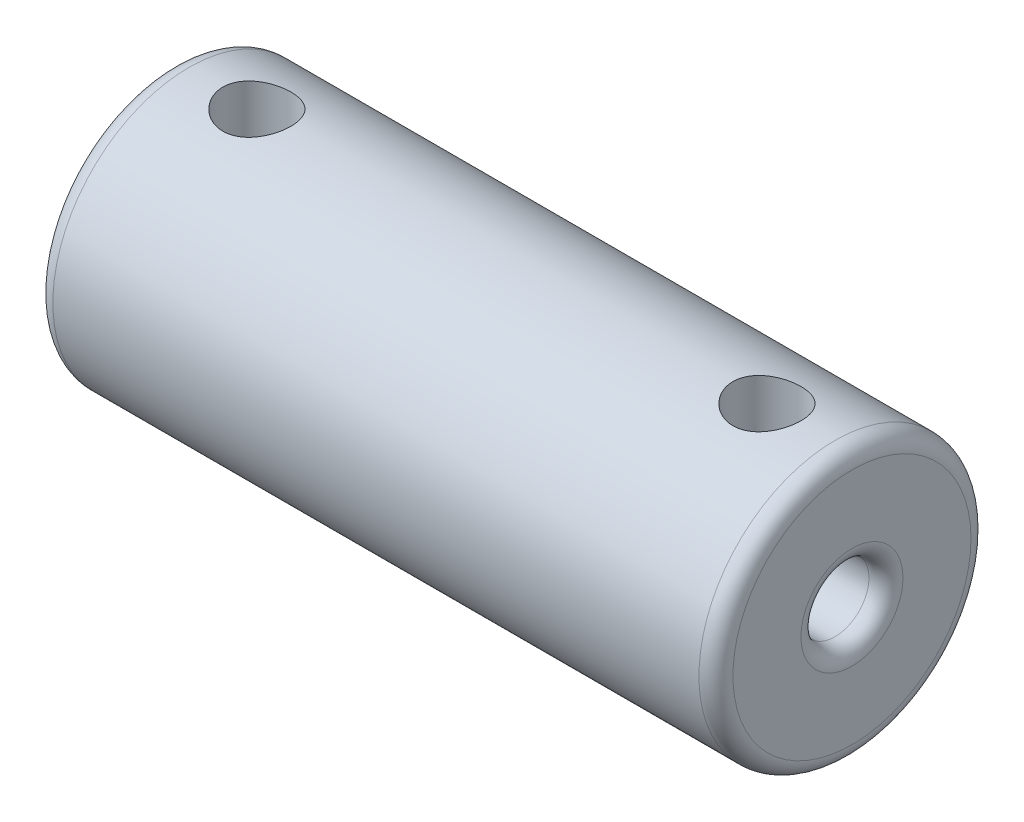
ISO-10303-21;
HEADER;
FILE_DESCRIPTION(('STEP AP214'),'2;1');
FILE_NAME('part.step','',(''),(''),'','','');
FILE_SCHEMA(('AUTOMOTIVE_DESIGN { 1 0 10303 214 1 1 1 1 }'));
ENDSEC;
DATA;
#1=APPLICATION_CONTEXT('core data for automotive mechanical design processes');
#2=APPLICATION_PROTOCOL_DEFINITION('international standard','automotive_design',2000,#1);
#3=PRODUCT_CONTEXT('',#1,'mechanical');
#4=PRODUCT('Part','Part','',(#3));
#5=PRODUCT_RELATED_PRODUCT_CATEGORY('part','',(#4));
#6=PRODUCT_DEFINITION_FORMATION('','',#4);
#7=PRODUCT_DEFINITION_CONTEXT('part definition',#1,'design');
#8=PRODUCT_DEFINITION('design','',#6,#7);
#9=PRODUCT_DEFINITION_SHAPE('','',#8);
#10=(LENGTH_UNIT() NAMED_UNIT(*) SI_UNIT(.MILLI.,.METRE.));
#11=(NAMED_UNIT(*) PLANE_ANGLE_UNIT() SI_UNIT($,.RADIAN.));
#12=(NAMED_UNIT(*) SI_UNIT($,.STERADIAN.) SOLID_ANGLE_UNIT());
#13=UNCERTAINTY_MEASURE_WITH_UNIT(LENGTH_MEASURE(1.E-05),#10,'distance_accuracy_value','');
#14=(GEOMETRIC_REPRESENTATION_CONTEXT(3) GLOBAL_UNCERTAINTY_ASSIGNED_CONTEXT((#13)) GLOBAL_UNIT_ASSIGNED_CONTEXT((#10,
#11,#12)) REPRESENTATION_CONTEXT('',''));
#15=CARTESIAN_POINT('',(0.,0.,0.));
#16=DIRECTION('',(0.,0.,1.));
#17=DIRECTION('',(1.,0.,0.));
#18=AXIS2_PLACEMENT_3D('',#15,#16,#17);
#19=CARTESIAN_POINT('',(-10.,0.,0.));
#20=DIRECTION('',(1.,0.,0.));
#21=DIRECTION('',(0.,0.,-1.));
#22=AXIS2_PLACEMENT_3D('',#19,#20,#21);
#23=CYLINDRICAL_SURFACE('',#22,4.);
#24=CARTESIAN_POINT('',(9.5,0.,0.));
#25=DIRECTION('',(1.,0.,0.));
#26=DIRECTION('',(0.,0.,-1.));
#27=AXIS2_PLACEMENT_3D('',#24,#25,#26);
#28=CIRCLE('',#27,4.);
#29=CARTESIAN_POINT('',(9.5,0.,-4.));
#30=VERTEX_POINT('',#29);
#31=EDGE_CURVE('E144',#30,#30,#28,.F.);
#32=ORIENTED_EDGE('',*,*,#31,.T.);
#33=EDGE_LOOP('',(#32));
#34=FACE_BOUND('',#33,.T.);
#35=CARTESIAN_POINT('',(-9.5,0.,0.));
#36=DIRECTION('',(1.,0.,0.));
#37=DIRECTION('',(0.,0.,-1.));
#38=AXIS2_PLACEMENT_3D('',#35,#36,#37);
#39=CIRCLE('',#38,4.);
#40=CARTESIAN_POINT('',(-9.5,0.,-4.));
#41=VERTEX_POINT('',#40);
#42=EDGE_CURVE('E143',#41,#41,#39,.T.);
#43=ORIENTED_EDGE('',*,*,#42,.T.);
#44=EDGE_LOOP('',(#43));
#45=FACE_BOUND('',#44,.T.);
#46=CARTESIAN_POINT('',(7.5,3.87298334620742,-1.));
#47=CARTESIAN_POINT('',(7.44477969964321,3.87298440057185,-0.999998431438699));
#48=CARTESIAN_POINT('',(7.38954204056864,3.87417722499278,-0.995410498208069));
#49=CARTESIAN_POINT('',(7.28065296876739,3.87880744892249,-0.977209250194446));
#50=CARTESIAN_POINT('',(7.22700249822003,3.8822461547418,-0.963590682698077));
#51=CARTESIAN_POINT('',(7.12287858471216,3.89095489813012,-0.927796479849634));
#52=CARTESIAN_POINT('',(7.07240113784224,3.8962225706936,-0.905631891140942));
#53=CARTESIAN_POINT('',(6.97587565898752,3.90799276818327,-0.853408456505405));
#54=CARTESIAN_POINT('',(6.92982781516885,3.91449534553241,-0.823349275424504));
#55=CARTESIAN_POINT('',(6.84245534189415,3.92816286540368,-0.755483370924517));
#56=CARTESIAN_POINT('',(6.80124255985972,3.93533839048709,-0.717534755081557));
#57=CARTESIAN_POINT('',(6.72569544225612,3.94945150206622,-0.635272825640327));
#58=CARTESIAN_POINT('',(6.69136174975137,3.95638906626691,-0.590958917672139));
#59=CARTESIAN_POINT('',(6.63008981294742,3.96936166208095,-0.496458080431564));
#60=CARTESIAN_POINT('',(6.60326144473539,3.975382749602,-0.446197830478043));
#61=CARTESIAN_POINT('',(6.55847614233878,3.9857232477043,-0.341705273717109));
#62=CARTESIAN_POINT('',(6.5405178992338,3.99004290933747,-0.287473554316777));
#63=CARTESIAN_POINT('',(6.51434086616856,3.99641903539262,-0.177743503501663));
#64=CARTESIAN_POINT('',(6.50593214226936,3.99851957537723,-0.12229308781959));
#65=CARTESIAN_POINT('',(6.49849664828978,4.00037437642922,-0.010731527705108));
#66=CARTESIAN_POINT('',(6.49946849111616,4.00012898438682,0.0453795178152275));
#67=CARTESIAN_POINT('',(6.51062994010006,3.99735237981413,0.155352247172387));
#68=CARTESIAN_POINT('',(6.52061453002154,3.99487200936349,0.209236215601067));
#69=CARTESIAN_POINT('',(6.5491885080194,3.98796334609942,0.314538247413686));
#70=CARTESIAN_POINT('',(6.56777835415096,3.98353494959376,0.365956179370438));
#71=CARTESIAN_POINT('',(6.61320102827482,3.97315003880358,0.465406703501806));
#72=CARTESIAN_POINT('',(6.6401068178647,3.96718007878021,0.513404509766504));
#73=CARTESIAN_POINT('',(6.7013422716465,3.9543596152386,0.604275622340488));
#74=CARTESIAN_POINT('',(6.73567322742425,3.94750895860996,0.647148035085505));
#75=CARTESIAN_POINT('',(6.81188349679295,3.93345485507808,0.727774035084956));
#76=CARTESIAN_POINT('',(6.85394195693911,3.92624687810367,0.765357679075199));
#77=CARTESIAN_POINT('',(6.9438399894161,3.91246017406683,0.832976375963018));
#78=CARTESIAN_POINT('',(6.9916798317964,3.90588147642388,0.863011076046016));
#79=CARTESIAN_POINT('',(7.09211601365958,3.89408198732659,0.914788129022597));
#80=CARTESIAN_POINT('',(7.14473429212528,3.88886793490288,0.936489566970491));
#81=CARTESIAN_POINT('',(7.25303418723058,3.88047456055983,0.97068562063634));
#82=CARTESIAN_POINT('',(7.30871514559325,3.87729480324087,0.983182206552909));
#83=CARTESIAN_POINT('',(7.41998380060925,3.87342142415656,0.99833185546607));
#84=CARTESIAN_POINT('',(7.47553511733185,3.87266435637459,1.00123618956785));
#85=CARTESIAN_POINT('',(7.58632877463126,3.87354937392416,0.997806796206218));
#86=CARTESIAN_POINT('',(7.64157114318049,3.87519123840506,0.991473919139519));
#87=CARTESIAN_POINT('',(7.74924570598188,3.88062832781824,0.969970185575064));
#88=CARTESIAN_POINT('',(7.80170909062833,3.8843878809375,0.954945627312698));
#89=CARTESIAN_POINT('',(7.90337258314067,3.89360287308385,0.916647232668248));
#90=CARTESIAN_POINT('',(7.95257230362213,3.89905851299445,0.893372419085018));
#91=CARTESIAN_POINT('',(8.04737651114694,3.91118454837305,0.838708267174623));
#92=CARTESIAN_POINT('',(8.09289153601724,3.91787667442657,0.807168701534251));
#93=CARTESIAN_POINT('',(8.17807534512054,3.93166833228686,0.737060292934455));
#94=CARTESIAN_POINT('',(8.21774316666003,3.93876793091388,0.698490294805438));
#95=CARTESIAN_POINT('',(8.29112441702838,3.95278961212643,0.614262720984725));
#96=CARTESIAN_POINT('',(8.32466402501952,3.95970280824734,0.568451952531592));
#97=CARTESIAN_POINT('',(8.3835743467805,3.97238886645494,0.471702682694675));
#98=CARTESIAN_POINT('',(8.40894548664328,3.97816178801584,0.420764448957591));
#99=CARTESIAN_POINT('',(8.45057841381117,3.98788046295326,0.31555820173109));
#100=CARTESIAN_POINT('',(8.46690571375162,3.99183932008964,0.261317381027882));
#101=CARTESIAN_POINT('',(8.49018413384336,3.99754117358315,0.150749760318808));
#102=CARTESIAN_POINT('',(8.49713706349562,3.99928459757363,0.0944233650412442));
#103=CARTESIAN_POINT('',(8.50136758957553,4.00034169408811,-0.0170835264433256));
#104=CARTESIAN_POINT('',(8.49890170909539,3.99971978880008,-0.0722538269660322));
#105=CARTESIAN_POINT('',(8.48495217270567,3.99625896457423,-0.181367496414739));
#106=CARTESIAN_POINT('',(8.47346878498689,3.99342011157094,-0.235310901780886));
#107=CARTESIAN_POINT('',(8.44194778022907,3.98585432853963,-0.340171035644815));
#108=CARTESIAN_POINT('',(8.42195654668537,3.98113764502669,-0.391102494581018));
#109=CARTESIAN_POINT('',(8.37402942098067,3.97031288913382,-0.488917053041467));
#110=CARTESIAN_POINT('',(8.34609252733043,3.96420464137727,-0.53579964126505));
#111=CARTESIAN_POINT('',(8.28228476600293,3.95107249681342,-0.625401928423899));
#112=CARTESIAN_POINT('',(8.24623985709263,3.94403016945647,-0.667994988300586));
#113=CARTESIAN_POINT('',(8.16757714802619,3.92990649053207,-0.746615020271251));
#114=CARTESIAN_POINT('',(8.12495768390205,3.92282512952424,-0.782640325068177));
#115=CARTESIAN_POINT('',(8.0333985857987,3.90927475860683,-0.847762026479239));
#116=CARTESIAN_POINT('',(7.98435587658752,3.90281963730391,-0.876716619446592));
#117=CARTESIAN_POINT('',(7.88194451007715,3.8914395555011,-0.925926896615621));
#118=CARTESIAN_POINT('',(7.82857903389271,3.88651348244814,-0.946188909759556));
#119=CARTESIAN_POINT('',(7.72942298817372,3.87951908741315,-0.974422528565571));
#120=CARTESIAN_POINT('',(7.68410683561764,3.87708663005761,-0.983993170595828));
#121=CARTESIAN_POINT('',(7.59253113099853,3.87381838580358,-0.996782292572819));
#122=CARTESIAN_POINT('',(7.54627165974937,3.87298246270639,-1.00000131437052));
#123=CARTESIAN_POINT('',(7.5,3.87298334620742,-1.));
#124=B_SPLINE_CURVE_WITH_KNOTS('',3,(#46,#47,#48,#49,#50,#51,#52,#53,#54,#55,#56,#57,#58,#59,
#60,#61,#62,#63,#64,#65,#66,#67,#68,#69,#70,#71,#72,#73,#74,#75,#76,#77,#78,#79,#80,#81,#82,#83,
#84,#85,#86,#87,#88,#89,#90,#91,#92,#93,#94,#95,#96,#97,#98,#99,#100,#101,#102,#103,#104,#105,
#106,#107,#108,#109,#110,#111,#112,#113,#114,#115,#116,#117,#118,#119,#120,#121,#122,#123),
.UNSPECIFIED.,.T.,.F.,(4,2,2,2,2,2,2,2,2,2,2,2,2,2,2,2,2,2,2,2,2,2,2,2,2,2,2,2,2,2,2,2,2,2,2,2,
2,2,4),(0.,0.16549097667523,0.331078296534211,0.496452290829154,0.661833306984659,
0.830495816734649,0.999174085882211,1.17020598555442,1.34121263935111,1.50875500394413,
1.67627259462683,1.84007305071853,2.00388222686189,2.16917149698052,2.3344895418384,
2.50428186625039,2.67408212476195,2.84470572799635,3.01529280048093,3.18137429900961,
3.34744050869795,3.51078961999957,3.67415808564841,3.84073138339937,4.00733207550292,
4.17810132382402,4.34886166284095,4.51836829119046,4.68784219559889,4.85273378447257,
5.01762046947067,5.18161950620158,5.34563922291503,5.51358838629102,5.68158012622478,
5.85270590910145,6.02370688542922,6.16239130867206,6.30106390036083),.UNSPECIFIED.);
#125=CARTESIAN_POINT('',(7.5,3.87298334620742,-1.));
#126=VERTEX_POINT('',#125);
#127=EDGE_CURVE('E57',#126,#126,#124,.T.);
#128=ORIENTED_EDGE('',*,*,#127,.F.);
#129=EDGE_LOOP('',(#128));
#130=FACE_BOUND('',#129,.T.);
#131=CARTESIAN_POINT('',(-7.5,3.87298334620742,-1.));
#132=CARTESIAN_POINT('',(-7.55522030035679,3.87298440057185,-0.999998431438699));
#133=CARTESIAN_POINT('',(-7.61045795943136,3.87417722499278,-0.995410498208069));
#134=CARTESIAN_POINT('',(-7.71934703123261,3.87880744892249,-0.977209250194446));
#135=CARTESIAN_POINT('',(-7.77299750177997,3.8822461547418,-0.963590682698077));
#136=CARTESIAN_POINT('',(-7.87712141528784,3.89095489813012,-0.927796479849635));
#137=CARTESIAN_POINT('',(-7.92759886215776,3.8962225706936,-0.905631891140944));
#138=CARTESIAN_POINT('',(-8.02412434101248,3.90799276818327,-0.853408456505407));
#139=CARTESIAN_POINT('',(-8.07017218483115,3.91449534553241,-0.823349275424505));
#140=CARTESIAN_POINT('',(-8.15754465810585,3.92816286540368,-0.755483370924518));
#141=CARTESIAN_POINT('',(-8.19875744014028,3.93533839048709,-0.717534755081558));
#142=CARTESIAN_POINT('',(-8.27430455774388,3.94945150206622,-0.635272825640329));
#143=CARTESIAN_POINT('',(-8.30863825024863,3.95638906626691,-0.590958917672141));
#144=CARTESIAN_POINT('',(-8.36991018705258,3.96936166208095,-0.496458080431566));
#145=CARTESIAN_POINT('',(-8.39673855526461,3.975382749602,-0.446197830478045));
#146=CARTESIAN_POINT('',(-8.44152385766121,3.9857232477043,-0.341705273717111));
#147=CARTESIAN_POINT('',(-8.4594821007662,3.99004290933747,-0.287473554316779));
#148=CARTESIAN_POINT('',(-8.48565913383144,3.99641903539262,-0.177743503501665));
#149=CARTESIAN_POINT('',(-8.49406785773064,3.99851957537723,-0.122293087819592));
#150=CARTESIAN_POINT('',(-8.50150335171022,4.00037437642922,-0.0107315277051099));
#151=CARTESIAN_POINT('',(-8.50053150888384,4.00012898438682,0.0453795178152256));
#152=CARTESIAN_POINT('',(-8.48937005989994,3.99735237981413,0.155352247172386));
#153=CARTESIAN_POINT('',(-8.47938546997846,3.99487200936349,0.209236215601066));
#154=CARTESIAN_POINT('',(-8.4508114919806,3.98796334609942,0.314538247413685));
#155=CARTESIAN_POINT('',(-8.43222164584904,3.98353494959376,0.365956179370436));
#156=CARTESIAN_POINT('',(-8.38679897172518,3.97315003880358,0.465406703501805));
#157=CARTESIAN_POINT('',(-8.3598931821353,3.96718007878021,0.513404509766503));
#158=CARTESIAN_POINT('',(-8.2986577283535,3.9543596152386,0.604275622340488));
#159=CARTESIAN_POINT('',(-8.26432677257575,3.94750895860996,0.647148035085504));
#160=CARTESIAN_POINT('',(-8.18811650320705,3.93345485507808,0.727774035084955));
#161=CARTESIAN_POINT('',(-8.14605804306089,3.92624687810367,0.765357679075198));
#162=CARTESIAN_POINT('',(-8.0561600105839,3.91246017406683,0.832976375963017));
#163=CARTESIAN_POINT('',(-8.0083201682036,3.90588147642388,0.863011076046015));
#164=CARTESIAN_POINT('',(-7.90788398634042,3.89408198732659,0.914788129022597));
#165=CARTESIAN_POINT('',(-7.85526570787472,3.88886793490288,0.93648956697049));
#166=CARTESIAN_POINT('',(-7.74696581276942,3.88047456055983,0.97068562063634));
#167=CARTESIAN_POINT('',(-7.69128485440675,3.87729480324087,0.983182206552909));
#168=CARTESIAN_POINT('',(-7.58001619939076,3.87342142415656,0.99833185546607));
#169=CARTESIAN_POINT('',(-7.52446488266815,3.87266435637459,1.00123618956785));
#170=CARTESIAN_POINT('',(-7.41367122536874,3.87354937392416,0.997806796206219));
#171=CARTESIAN_POINT('',(-7.35842885681951,3.87519123840506,0.99147391913952));
#172=CARTESIAN_POINT('',(-7.25075429401812,3.88062832781824,0.969970185575065));
#173=CARTESIAN_POINT('',(-7.19829090937167,3.8843878809375,0.954945627312698));
#174=CARTESIAN_POINT('',(-7.09662741685933,3.89360287308385,0.916647232668248));
#175=CARTESIAN_POINT('',(-7.04742769637787,3.89905851299445,0.893372419085018));
#176=CARTESIAN_POINT('',(-6.95262348885306,3.91118454837305,0.838708267174623));
#177=CARTESIAN_POINT('',(-6.90710846398276,3.91787667442657,0.807168701534252));
#178=CARTESIAN_POINT('',(-6.82192465487946,3.93166833228686,0.737060292934457));
#179=CARTESIAN_POINT('',(-6.78225683333997,3.93876793091388,0.69849029480544));
#180=CARTESIAN_POINT('',(-6.70887558297162,3.95278961212643,0.614262720984727));
#181=CARTESIAN_POINT('',(-6.67533597498048,3.95970280824734,0.568451952531594));
#182=CARTESIAN_POINT('',(-6.6164256532195,3.97238886645493,0.471702682694677));
#183=CARTESIAN_POINT('',(-6.59105451335672,3.97816178801584,0.420764448957593));
#184=CARTESIAN_POINT('',(-6.54942158618883,3.98788046295326,0.315558201731092));
#185=CARTESIAN_POINT('',(-6.53309428624838,3.99183932008964,0.261317381027883));
#186=CARTESIAN_POINT('',(-6.50981586615663,3.99754117358315,0.150749760318809));
#187=CARTESIAN_POINT('',(-6.50286293650438,3.99928459757363,0.0944233650412453));
#188=CARTESIAN_POINT('',(-6.49863241042447,4.00034169408811,-0.0170835264433247));
#189=CARTESIAN_POINT('',(-6.50109829090461,3.99971978880008,-0.0722538269660316));
#190=CARTESIAN_POINT('',(-6.51504782729433,3.99625896457423,-0.181367496414738));
#191=CARTESIAN_POINT('',(-6.5265312150131,3.99342011157095,-0.235310901780885));
#192=CARTESIAN_POINT('',(-6.55805221977093,3.98585432853963,-0.340171035644814));
#193=CARTESIAN_POINT('',(-6.57804345331463,3.98113764502669,-0.391102494581017));
#194=CARTESIAN_POINT('',(-6.62597057901933,3.97031288913382,-0.488917053041466));
#195=CARTESIAN_POINT('',(-6.65390747266957,3.96420464137727,-0.535799641265049));
#196=CARTESIAN_POINT('',(-6.71771523399707,3.95107249681342,-0.625401928423899));
#197=CARTESIAN_POINT('',(-6.75376014290737,3.94403016945646,-0.667994988300586));
#198=CARTESIAN_POINT('',(-6.83242285197381,3.92990649053207,-0.746615020271251));
#199=CARTESIAN_POINT('',(-6.87504231609794,3.92282512952424,-0.782640325068176));
#200=CARTESIAN_POINT('',(-6.96660141420129,3.90927475860683,-0.847762026479239));
#201=CARTESIAN_POINT('',(-7.01564412341248,3.90281963730391,-0.876716619446592));
#202=CARTESIAN_POINT('',(-7.11805548992285,3.8914395555011,-0.925926896615621));
#203=CARTESIAN_POINT('',(-7.17142096610729,3.88651348244814,-0.946188909759556));
#204=CARTESIAN_POINT('',(-7.27057701182627,3.87951908741315,-0.97442252856557));
#205=CARTESIAN_POINT('',(-7.31589316438236,3.87708663005761,-0.983993170595828));
#206=CARTESIAN_POINT('',(-7.40746886900147,3.87381838580358,-0.996782292572819));
#207=CARTESIAN_POINT('',(-7.45372834025063,3.87298246270639,-1.00000131437052));
#208=CARTESIAN_POINT('',(-7.5,3.87298334620742,-1.));
#209=B_SPLINE_CURVE_WITH_KNOTS('',3,(#131,#132,#133,#134,#135,#136,#137,#138,#139,#140,#141,
#142,#143,#144,#145,#146,#147,#148,#149,#150,#151,#152,#153,#154,#155,#156,#157,#158,#159,#160,
#161,#162,#163,#164,#165,#166,#167,#168,#169,#170,#171,#172,#173,#174,#175,#176,#177,#178,#179,
#180,#181,#182,#183,#184,#185,#186,#187,#188,#189,#190,#191,#192,#193,#194,#195,#196,#197,#198,
#199,#200,#201,#202,#203,#204,#205,#206,#207,#208),.UNSPECIFIED.,.T.,.F.,(4,2,2,2,2,2,2,2,2,2,2,
2,2,2,2,2,2,2,2,2,2,2,2,2,2,2,2,2,2,2,2,2,2,2,2,2,2,2,4),(0.,0.16549097667523,0.33107829653421,
0.496452290829151,0.661833306984657,0.830495816734647,0.999174085882209,1.17020598555442,
1.34121263935111,1.50875500394413,1.67627259462682,1.84007305071853,2.00388222686189,
2.16917149698052,2.3344895418384,2.50428186625039,2.67408212476195,2.84470572799635,
3.01529280048093,3.18137429900961,3.34744050869795,3.51078961999957,3.67415808564841,
3.84073138339937,4.00733207550292,4.17810132382402,4.34886166284096,4.51836829119046,
4.6878421955989,4.85273378447257,5.01762046947067,5.18161950620159,5.34563922291503,
5.51358838629103,5.68158012622478,5.85270590910145,6.02370688542922,6.16239130867206,
6.30106390036083),.UNSPECIFIED.);
#210=CARTESIAN_POINT('',(-7.5,3.87298334620742,-1.));
#211=VERTEX_POINT('',#210);
#212=EDGE_CURVE('E88',#211,#211,#209,.T.);
#213=ORIENTED_EDGE('',*,*,#212,.F.);
#214=EDGE_LOOP('',(#213));
#215=FACE_BOUND('',#214,.T.);
#216=ADVANCED_FACE('F36',(#34,#45,#130,#215),#23,.T.);
#217=CARTESIAN_POINT('',(0.,0.,0.));
#218=DIRECTION('',(1.,0.,0.));
#219=DIRECTION('',(0.,0.,-1.));
#220=AXIS2_PLACEMENT_3D('',#217,#218,#219);
#221=CYLINDRICAL_SURFACE('',#220,1.);
#222=CARTESIAN_POINT('',(9.5,0.,0.));
#223=DIRECTION('',(1.,0.,0.));
#224=DIRECTION('',(0.,0.,-1.));
#225=AXIS2_PLACEMENT_3D('',#222,#223,#224);
#226=CIRCLE('',#225,1.);
#227=CARTESIAN_POINT('',(9.5,0.,-1.));
#228=VERTEX_POINT('',#227);
#229=EDGE_CURVE('E161',#228,#228,#226,.T.);
#230=ORIENTED_EDGE('',*,*,#229,.T.);
#231=EDGE_LOOP('',(#230));
#232=FACE_BOUND('',#231,.T.);
#233=CARTESIAN_POINT('',(0.,0.,0.));
#234=DIRECTION('',(1.,0.,0.));
#235=DIRECTION('',(0.,0.,-1.));
#236=AXIS2_PLACEMENT_3D('',#233,#234,#235);
#237=CIRCLE('',#236,1.);
#238=CARTESIAN_POINT('',(0.,0.,-1.));
#239=VERTEX_POINT('',#238);
#240=EDGE_CURVE('E95',#239,#239,#237,.T.);
#241=ORIENTED_EDGE('',*,*,#240,.F.);
#242=EDGE_LOOP('',(#241));
#243=FACE_BOUND('',#242,.T.);
#244=CARTESIAN_POINT('',(7.5,0.,0.));
#245=DIRECTION('',(0.707106781186547,-0.707106781186547,0.));
#246=DIRECTION('',(-0.707106781186547,-0.707106781186547,0.));
#247=AXIS2_PLACEMENT_3D('',#244,#245,#246);
#248=ELLIPSE('',#247,1.41421356237309,1.);
#249=CARTESIAN_POINT('',(7.5,0.,1.));
#250=VERTEX_POINT('',#249);
#251=CARTESIAN_POINT('',(7.5,0.,-1.));
#252=VERTEX_POINT('',#251);
#253=EDGE_CURVE('E50',#250,#252,#248,.F.);
#254=ORIENTED_EDGE('',*,*,#253,.T.);
#255=CARTESIAN_POINT('',(7.5,0.,0.));
#256=DIRECTION('',(-0.707106781186547,-0.707106781186547,0.));
#257=DIRECTION('',(0.707106781186547,-0.707106781186547,0.));
#258=AXIS2_PLACEMENT_3D('',#255,#256,#257);
#259=ELLIPSE('',#258,1.41421356237309,1.);
#260=EDGE_CURVE('E52',#252,#250,#259,.F.);
#261=ORIENTED_EDGE('',*,*,#260,.T.);
#262=EDGE_LOOP('',(#254,#261));
#263=FACE_BOUND('',#262,.T.);
#264=ADVANCED_FACE('F56',(#232,#243,#263),#221,.F.);
#265=CARTESIAN_POINT('',(0.,0.,0.));
#266=DIRECTION('',(-1.,0.,0.));
#267=DIRECTION('',(0.,0.,1.));
#268=AXIS2_PLACEMENT_3D('',#265,#266,#267);
#269=CYLINDRICAL_SURFACE('',#268,2.);
#270=CARTESIAN_POINT('',(-9.5,0.,0.));
#271=DIRECTION('',(1.,0.,0.));
#272=DIRECTION('',(0.,0.,-1.));
#273=AXIS2_PLACEMENT_3D('',#270,#271,#272);
#274=CIRCLE('',#273,2.);
#275=CARTESIAN_POINT('',(-9.5,0.,-2.));
#276=VERTEX_POINT('',#275);
#277=EDGE_CURVE('E11',#276,#276,#274,.F.);
#278=ORIENTED_EDGE('',*,*,#277,.T.);
#279=EDGE_LOOP('',(#278));
#280=FACE_BOUND('',#279,.T.);
#281=CARTESIAN_POINT('',(0.,0.,0.));
#282=DIRECTION('',(-1.,0.,0.));
#283=DIRECTION('',(0.,0.,1.));
#284=AXIS2_PLACEMENT_3D('',#281,#282,#283);
#285=CIRCLE('',#284,2.);
#286=CARTESIAN_POINT('',(0.,0.,2.));
#287=VERTEX_POINT('',#286);
#288=EDGE_CURVE('E69',#287,#287,#285,.T.);
#289=ORIENTED_EDGE('',*,*,#288,.F.);
#290=EDGE_LOOP('',(#289));
#291=FACE_BOUND('',#290,.T.);
#292=CARTESIAN_POINT('',(-7.5,1.73205080756888,-1.));
#293=CARTESIAN_POINT('',(-7.55210780819525,1.73205534728459,-0.999996363074531));
#294=CARTESIAN_POINT('',(-7.60428141152505,1.73443801187756,-0.995899970733216));
#295=CARTESIAN_POINT('',(-7.70702726467715,1.74362366452052,-0.979723209898053));
#296=CARTESIAN_POINT('',(-7.75759591504341,1.75043594055559,-0.967626064554179));
#297=CARTESIAN_POINT('',(-7.85545166434394,1.76749346605398,-0.936099948699812));
#298=CARTESIAN_POINT('',(-7.90275465247359,1.77772043473252,-0.91670995249373));
#299=CARTESIAN_POINT('',(-7.99342420199672,1.80042664816858,-0.871267525376372));
#300=CARTESIAN_POINT('',(-8.03679055026246,1.81290601476065,-0.845214734035773));
#301=CARTESIAN_POINT('',(-8.12230572855751,1.83996869057441,-0.784666540530879));
#302=CARTESIAN_POINT('',(-8.16405913567355,1.85464063637954,-0.74965203614377));
#303=CARTESIAN_POINT('',(-8.24140838840671,1.88371982785706,-0.673253807614468));
#304=CARTESIAN_POINT('',(-8.27700116258352,1.8981269383125,-0.631866925782293));
#305=CARTESIAN_POINT('',(-8.34336715114766,1.92621476952949,-0.540489563414547));
#306=CARTESIAN_POINT('',(-8.37365376785953,1.93978106418172,-0.490107189012576));
#307=CARTESIAN_POINT('',(-8.42514085324576,1.96350756099529,-0.384157026599504));
#308=CARTESIAN_POINT('',(-8.44634705613717,1.97366991183742,-0.328592538138155));
#309=CARTESIAN_POINT('',(-8.4775046613011,1.98880461244237,-0.218044943925977));
#310=CARTESIAN_POINT('',(-8.48814952635553,1.99409480220892,-0.163301790488818));
#311=CARTESIAN_POINT('',(-8.50016611867504,2.00007583846067,-0.0525706286978484));
#312=CARTESIAN_POINT('',(-8.50154345679571,2.0007694678459,0.00341660584373814));
#313=CARTESIAN_POINT('',(-8.49525332602965,1.9976298191645,0.109832524423749));
#314=CARTESIAN_POINT('',(-8.48836198447878,1.9941849589216,0.160321199176791));
#315=CARTESIAN_POINT('',(-8.46711915609534,1.98374245259747,0.259313771918322));
#316=CARTESIAN_POINT('',(-8.45276711102378,1.97674454066394,0.307817521093925));
#317=CARTESIAN_POINT('',(-8.41691743391019,1.95971583287654,0.402309391569553));
#318=CARTESIAN_POINT('',(-8.39532368682793,1.94964441529199,0.448253423515178));
#319=CARTESIAN_POINT('',(-8.34573658379851,1.92737645986687,0.535976801513328));
#320=CARTESIAN_POINT('',(-8.31774093669765,1.91517916157484,0.577754648838646));
#321=CARTESIAN_POINT('',(-8.25310464846699,1.88844394399229,0.660173660898195));
#322=CARTESIAN_POINT('',(-8.21589697167399,1.87379375998175,0.70033407502936));
#323=CARTESIAN_POINT('',(-8.13541027506982,1.84454340586812,0.77410437029778));
#324=CARTESIAN_POINT('',(-8.09212662772594,1.82994328265629,0.807709211574231));
#325=CARTESIAN_POINT('',(-7.99735180757591,1.80144156092485,0.869505334642211));
#326=CARTESIAN_POINT('',(-7.94551397694579,1.78764319990708,0.897217314978051));
#327=CARTESIAN_POINT('',(-7.837062328641,1.76375450278576,0.943319113001231));
#328=CARTESIAN_POINT('',(-7.78045356698244,1.75366030046067,0.961718658210889));
#329=CARTESIAN_POINT('',(-7.66878548871721,1.73944635817034,0.98718021102504));
#330=CARTESIAN_POINT('',(-7.61395888095645,1.73491655848496,0.995025122119975));
#331=CARTESIAN_POINT('',(-7.50359865848346,1.7311791936161,1.00151694661143));
#332=CARTESIAN_POINT('',(-7.44806557088021,1.73196786889312,1.00017035731503));
#333=CARTESIAN_POINT('',(-7.34434608142127,1.73834336540585,0.989036043343966));
#334=CARTESIAN_POINT('',(-7.29602054889207,1.74339587506654,0.980187816712467));
#335=CARTESIAN_POINT('',(-7.20163221372904,1.75694021551341,0.955696284632441));
#336=CARTESIAN_POINT('',(-7.15557014925339,1.76543316005034,0.940050778623614));
#337=CARTESIAN_POINT('',(-7.06458866909731,1.78536222079657,0.901647588604886));
#338=CARTESIAN_POINT('',(-7.01982098314645,1.79691643243063,0.878594063692723));
#339=CARTESIAN_POINT('',(-6.93453072846101,1.8215611949725,0.826287064015804));
#340=CARTESIAN_POINT('',(-6.89401035648672,1.83465253355148,0.797030404332216));
#341=CARTESIAN_POINT('',(-6.81302123247645,1.86287998456336,0.728837167198853));
#342=CARTESIAN_POINT('',(-6.77320284928234,1.87806583154289,0.689145272314966));
#343=CARTESIAN_POINT('',(-6.70058776200641,1.90734234977892,0.603404495398289));
#344=CARTESIAN_POINT('',(-6.66779342976946,1.92143265007709,0.557353474655347));
#345=CARTESIAN_POINT('',(-6.6094262740499,1.94741361690957,0.458535362558757));
#346=CARTESIAN_POINT('',(-6.58406688178909,1.95923641672029,0.405623097574113));
#347=CARTESIAN_POINT('',(-6.54286209614261,1.97883354959301,0.295522364641082));
#348=CARTESIAN_POINT('',(-6.5270083486337,1.98661143676373,0.238337701392176));
#349=CARTESIAN_POINT('',(-6.50663143582534,1.99667508181883,0.126979682330417));
#350=CARTESIAN_POINT('',(-6.50120212412389,1.99939927908191,0.0730114438504571));
#351=CARTESIAN_POINT('',(-6.4991567345456,2.00042130375131,-0.0351259859512033));
#352=CARTESIAN_POINT('',(-6.50253757147644,1.9987206806689,-0.0892951002950865));
#353=CARTESIAN_POINT('',(-6.51741640679563,1.99133968837923,-0.192537992317147));
#354=CARTESIAN_POINT('',(-6.52836484925767,1.9859289466799,-0.241712317811264));
#355=CARTESIAN_POINT('',(-6.55732699930297,1.97192093663423,-0.337445952183617));
#356=CARTESIAN_POINT('',(-6.57534172009345,1.96332321132796,-0.384004884955508));
#357=CARTESIAN_POINT('',(-6.61872705216598,1.9432593074812,-0.475423406244884));
#358=CARTESIAN_POINT('',(-6.64437932320784,1.93168617198799,-0.520125142700046));
#359=CARTESIAN_POINT('',(-6.70195793085905,1.90688133141826,-0.604774641814024));
#360=CARTESIAN_POINT('',(-6.73388714911567,1.89364886558361,-0.644720207414907));
#361=CARTESIAN_POINT('',(-6.8067971390227,1.86528610226628,-0.722914004156891));
#362=CARTESIAN_POINT('',(-6.84836248747719,1.85009799011698,-0.760597684539271));
#363=CARTESIAN_POINT('',(-6.93745072112977,1.82063076162852,-0.828663287394675));
#364=CARTESIAN_POINT('',(-6.98497882086769,1.80635245761865,-0.859038750010058));
#365=CARTESIAN_POINT('',(-7.08663664658096,1.77999605304916,-0.912431079785654));
#366=CARTESIAN_POINT('',(-7.14092753112874,1.7680017425627,-0.935185065960939));
#367=CARTESIAN_POINT('',(-7.25333240433978,1.74866156328352,-0.970878709506412));
#368=CARTESIAN_POINT('',(-7.31143288891269,1.74130016147702,-0.983851191175346));
#369=CARTESIAN_POINT('',(-7.391805355652,1.73529272601791,-0.994367007864414));
#370=CARTESIAN_POINT('',(-7.41336789439789,1.73408129005152,-0.996476104963851));
#371=CARTESIAN_POINT('',(-7.45661648068224,1.7324593588775,-0.999293405089963));
#372=CARTESIAN_POINT('',(-7.47830253638588,1.73204891725109,-1.00000151439987));
#373=CARTESIAN_POINT('',(-7.5,1.73205080756888,-1.));
#374=B_SPLINE_CURVE_WITH_KNOTS('',3,(#292,#293,#294,#295,#296,#297,#298,#299,#300,#301,#302,
#303,#304,#305,#306,#307,#308,#309,#310,#311,#312,#313,#314,#315,#316,#317,#318,#319,#320,#321,
#322,#323,#324,#325,#326,#327,#328,#329,#330,#331,#332,#333,#334,#335,#336,#337,#338,#339,#340,
#341,#342,#343,#344,#345,#346,#347,#348,#349,#350,#351,#352,#353,#354,#355,#356,#357,#358,#359,
#360,#361,#362,#363,#364,#365,#366,#367,#368,#369,#370,#371,#372,#373),.UNSPECIFIED.,.T.,.F.,(4,
2,2,2,2,2,2,2,2,2,2,2,2,2,2,2,2,2,2,2,2,2,2,2,2,2,2,2,2,2,2,2,2,2,2,2,2,2,2,2,4),(0.,
0.156232122594716,0.312792892824805,0.468528595918885,0.62427272544515,0.792862312498234,
0.961535710843708,1.14157892238763,1.32150826963891,1.48863484967935,1.6556602368604,
1.80816097484538,1.96067312517455,2.11529534731147,2.26997299350272,2.43927191456891,
2.60870048245919,2.78888841729448,2.96888774211705,3.13462290854212,3.30024093188373,
3.44774183424025,3.59529052436063,3.74967296406088,3.90413486220047,4.07806743580613,
4.25205864978202,4.43064181412966,4.60906779808771,4.77112270389487,4.93312086793971,
5.08444424871492,5.23578933512013,5.39360750719472,5.55149830100719,5.72510241850067,
5.89885942845154,6.07810749038605,6.2567513300276,6.32180135185309,6.3868557249454),.UNSPECIFIED.);
#375=CARTESIAN_POINT('',(-7.5,1.73205080756888,-1.));
#376=VERTEX_POINT('',#375);
#377=EDGE_CURVE('E60',#376,#376,#374,.T.);
#378=ORIENTED_EDGE('',*,*,#377,.T.);
#379=EDGE_LOOP('',(#378));
#380=FACE_BOUND('',#379,.T.);
#381=ADVANCED_FACE('F99',(#280,#291,#380),#269,.F.);
#382=CARTESIAN_POINT('',(-10.,0.,0.));
#383=DIRECTION('',(1.,0.,0.));
#384=DIRECTION('',(0.,0.,-1.));
#385=AXIS2_PLACEMENT_3D('',#382,#383,#384);
#386=PLANE('',#385);
#387=CARTESIAN_POINT('',(-10.,0.,0.));
#388=DIRECTION('',(1.,0.,0.));
#389=DIRECTION('',(0.,0.,-1.));
#390=AXIS2_PLACEMENT_3D('',#387,#388,#389);
#391=CIRCLE('',#390,3.5);
#392=CARTESIAN_POINT('',(-10.,0.,-3.5));
#393=VERTEX_POINT('',#392);
#394=EDGE_CURVE('E44',#393,#393,#391,.F.);
#395=ORIENTED_EDGE('',*,*,#394,.T.);
#396=EDGE_LOOP('',(#395));
#397=FACE_BOUND('',#396,.T.);
#398=CARTESIAN_POINT('',(-10.,0.,0.));
#399=DIRECTION('',(1.,0.,0.));
#400=DIRECTION('',(0.,0.,-1.));
#401=AXIS2_PLACEMENT_3D('',#398,#399,#400);
#402=CIRCLE('',#401,2.5);
#403=CARTESIAN_POINT('',(-10.,0.,-2.5));
#404=VERTEX_POINT('',#403);
#405=EDGE_CURVE('E147',#404,#404,#402,.T.);
#406=ORIENTED_EDGE('',*,*,#405,.T.);
#407=EDGE_LOOP('',(#406));
#408=FACE_BOUND('',#407,.T.);
#409=ADVANCED_FACE('F102',(#397,#408),#386,.F.);
#410=CARTESIAN_POINT('',(10.,0.,0.));
#411=DIRECTION('',(1.,0.,0.));
#412=DIRECTION('',(0.,0.,-1.));
#413=AXIS2_PLACEMENT_3D('',#410,#411,#412);
#414=PLANE('',#413);
#415=CARTESIAN_POINT('',(10.,0.,0.));
#416=DIRECTION('',(1.,0.,0.));
#417=DIRECTION('',(0.,0.,-1.));
#418=AXIS2_PLACEMENT_3D('',#415,#416,#417);
#419=CIRCLE('',#418,1.5);
#420=CARTESIAN_POINT('',(10.,0.,-1.5));
#421=VERTEX_POINT('',#420);
#422=EDGE_CURVE('E145',#421,#421,#419,.F.);
#423=ORIENTED_EDGE('',*,*,#422,.T.);
#424=EDGE_LOOP('',(#423));
#425=FACE_BOUND('',#424,.T.);
#426=CARTESIAN_POINT('',(10.,0.,0.));
#427=DIRECTION('',(1.,0.,0.));
#428=DIRECTION('',(0.,0.,-1.));
#429=AXIS2_PLACEMENT_3D('',#426,#427,#428);
#430=CIRCLE('',#429,3.5);
#431=CARTESIAN_POINT('',(10.,0.,-3.5));
#432=VERTEX_POINT('',#431);
#433=EDGE_CURVE('E150',#432,#432,#430,.T.);
#434=ORIENTED_EDGE('',*,*,#433,.T.);
#435=EDGE_LOOP('',(#434));
#436=FACE_BOUND('',#435,.T.);
#437=ADVANCED_FACE('F109',(#425,#436),#414,.T.);
#438=CARTESIAN_POINT('',(0.,0.,0.));
#439=DIRECTION('',(-1.,0.,0.));
#440=DIRECTION('',(0.,0.,1.));
#441=AXIS2_PLACEMENT_3D('',#438,#439,#440);
#442=PLANE('',#441);
#443=ORIENTED_EDGE('',*,*,#288,.T.);
#444=EDGE_LOOP('',(#443));
#445=FACE_BOUND('',#444,.T.);
#446=ORIENTED_EDGE('',*,*,#240,.T.);
#447=EDGE_LOOP('',(#446));
#448=FACE_BOUND('',#447,.T.);
#449=ADVANCED_FACE('F79',(#445,#448),#442,.T.);
#450=CARTESIAN_POINT('',(-7.5,4.001,0.));
#451=DIRECTION('',(0.,-1.,0.));
#452=DIRECTION('',(0.,0.,-1.));
#453=AXIS2_PLACEMENT_3D('',#450,#451,#452);
#454=CYLINDRICAL_SURFACE('',#453,1.);
#455=ORIENTED_EDGE('',*,*,#212,.T.);
#456=EDGE_LOOP('',(#455));
#457=FACE_BOUND('',#456,.T.);
#458=ORIENTED_EDGE('',*,*,#377,.F.);
#459=EDGE_LOOP('',(#458));
#460=FACE_BOUND('',#459,.T.);
#461=ADVANCED_FACE('F75',(#457,#460),#454,.F.);
#462=CARTESIAN_POINT('',(7.5,4.001,0.));
#463=DIRECTION('',(0.,-1.,0.));
#464=DIRECTION('',(0.,0.,-1.));
#465=AXIS2_PLACEMENT_3D('',#462,#463,#464);
#466=CYLINDRICAL_SURFACE('',#465,1.);
#467=ORIENTED_EDGE('',*,*,#127,.T.);
#468=EDGE_LOOP('',(#467));
#469=FACE_BOUND('',#468,.T.);
#470=ORIENTED_EDGE('',*,*,#260,.F.);
#471=ORIENTED_EDGE('',*,*,#253,.F.);
#472=EDGE_LOOP('',(#470,#471));
#473=FACE_BOUND('',#472,.T.);
#474=ADVANCED_FACE('F53',(#469,#473),#466,.F.);
#475=CARTESIAN_POINT('',(9.5,0.,0.));
#476=DIRECTION('',(1.,0.,0.));
#477=DIRECTION('',(0.,0.,-1.));
#478=AXIS2_PLACEMENT_3D('',#475,#476,#477);
#479=TOROIDAL_SURFACE('',#478,1.5,0.5);
#480=ORIENTED_EDGE('',*,*,#422,.F.);
#481=EDGE_LOOP('',(#480));
#482=FACE_BOUND('',#481,.T.);
#483=ORIENTED_EDGE('',*,*,#229,.F.);
#484=EDGE_LOOP('',(#483));
#485=FACE_BOUND('',#484,.T.);
#486=ADVANCED_FACE('F124',(#482,#485),#479,.T.);
#487=CARTESIAN_POINT('',(9.5,0.,0.));
#488=DIRECTION('',(1.,0.,0.));
#489=DIRECTION('',(0.,0.,-1.));
#490=AXIS2_PLACEMENT_3D('',#487,#488,#489);
#491=TOROIDAL_SURFACE('',#490,3.5,0.5);
#492=ORIENTED_EDGE('',*,*,#31,.F.);
#493=EDGE_LOOP('',(#492));
#494=FACE_BOUND('',#493,.T.);
#495=ORIENTED_EDGE('',*,*,#433,.F.);
#496=EDGE_LOOP('',(#495));
#497=FACE_BOUND('',#496,.T.);
#498=ADVANCED_FACE('F127',(#494,#497),#491,.T.);
#499=CARTESIAN_POINT('',(-9.5,0.,0.));
#500=DIRECTION('',(1.,0.,0.));
#501=DIRECTION('',(0.,0.,-1.));
#502=AXIS2_PLACEMENT_3D('',#499,#500,#501);
#503=TOROIDAL_SURFACE('',#502,3.5,0.5);
#504=ORIENTED_EDGE('',*,*,#394,.F.);
#505=EDGE_LOOP('',(#504));
#506=FACE_BOUND('',#505,.T.);
#507=ORIENTED_EDGE('',*,*,#42,.F.);
#508=EDGE_LOOP('',(#507));
#509=FACE_BOUND('',#508,.T.);
#510=ADVANCED_FACE('F130',(#506,#509),#503,.T.);
#511=CARTESIAN_POINT('',(-9.5,0.,0.));
#512=DIRECTION('',(1.,0.,0.));
#513=DIRECTION('',(0.,0.,-1.));
#514=AXIS2_PLACEMENT_3D('',#511,#512,#513);
#515=TOROIDAL_SURFACE('',#514,2.5,0.5);
#516=ORIENTED_EDGE('',*,*,#405,.F.);
#517=EDGE_LOOP('',(#516));
#518=FACE_BOUND('',#517,.T.);
#519=ORIENTED_EDGE('',*,*,#277,.F.);
#520=EDGE_LOOP('',(#519));
#521=FACE_BOUND('',#520,.T.);
#522=ADVANCED_FACE('F38',(#518,#521),#515,.T.);
#523=CLOSED_SHELL('',(#216,#264,#381,#409,#437,#449,#461,#474,#486,#498,#510,#522));
#524=MANIFOLD_SOLID_BREP('B2',#523);
#525=ADVANCED_BREP_SHAPE_REPRESENTATION('',(#18,#524),#14);
#526=SHAPE_DEFINITION_REPRESENTATION(#9,#525);
ENDSEC;
END-ISO-10303-21;
